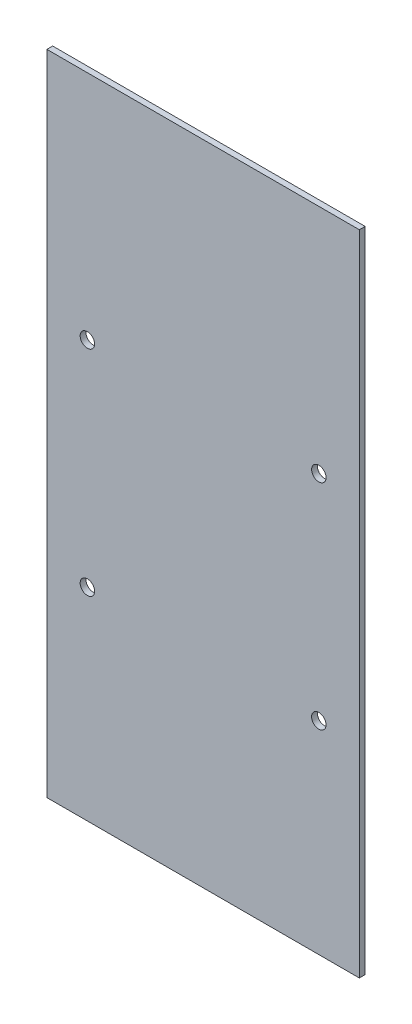
ISO-10303-21;
HEADER;
FILE_DESCRIPTION(('STEP AP214'),'2;1');
FILE_NAME('part.step','',(''),(''),'','','');
FILE_SCHEMA(('AUTOMOTIVE_DESIGN { 1 0 10303 214 1 1 1 1 }'));
ENDSEC;
DATA;
#1=APPLICATION_CONTEXT('core data for automotive mechanical design processes');
#2=APPLICATION_PROTOCOL_DEFINITION('international standard','automotive_design',2000,#1);
#3=PRODUCT_CONTEXT('',#1,'mechanical');
#4=PRODUCT('Part','Part','',(#3));
#5=PRODUCT_RELATED_PRODUCT_CATEGORY('part','',(#4));
#6=PRODUCT_DEFINITION_FORMATION('','',#4);
#7=PRODUCT_DEFINITION_CONTEXT('part definition',#1,'design');
#8=PRODUCT_DEFINITION('design','',#6,#7);
#9=PRODUCT_DEFINITION_SHAPE('','',#8);
#10=(LENGTH_UNIT() NAMED_UNIT(*) SI_UNIT(.MILLI.,.METRE.));
#11=(NAMED_UNIT(*) PLANE_ANGLE_UNIT() SI_UNIT($,.RADIAN.));
#12=(NAMED_UNIT(*) SI_UNIT($,.STERADIAN.) SOLID_ANGLE_UNIT());
#13=UNCERTAINTY_MEASURE_WITH_UNIT(LENGTH_MEASURE(1.E-05),#10,'distance_accuracy_value','');
#14=(GEOMETRIC_REPRESENTATION_CONTEXT(3) GLOBAL_UNCERTAINTY_ASSIGNED_CONTEXT((#13)) GLOBAL_UNIT_ASSIGNED_CONTEXT((#10,
#11,#12)) REPRESENTATION_CONTEXT('',''));
#15=CARTESIAN_POINT('',(0.,0.,0.));
#16=DIRECTION('',(0.,0.,1.));
#17=DIRECTION('',(1.,0.,0.));
#18=AXIS2_PLACEMENT_3D('',#15,#16,#17);
#19=CARTESIAN_POINT('',(0.,0.,1.));
#20=DIRECTION('',(0.,0.,1.));
#21=DIRECTION('',(1.,0.,0.));
#22=AXIS2_PLACEMENT_3D('',#19,#20,#21);
#23=PLANE('',#22);
#24=CARTESIAN_POINT('',(20.,-21.,1.));
#25=DIRECTION('',(0.,0.,1.));
#26=DIRECTION('',(-1.,0.,0.));
#27=AXIS2_PLACEMENT_3D('',#24,#25,#26);
#28=CIRCLE('',#27,1.25);
#29=CARTESIAN_POINT('',(18.75,-21.,1.));
#30=VERTEX_POINT('',#29);
#31=EDGE_CURVE('E148',#30,#30,#28,.T.);
#32=ORIENTED_EDGE('',*,*,#31,.F.);
#33=EDGE_LOOP('',(#32));
#34=FACE_BOUND('',#33,.T.);
#35=CARTESIAN_POINT('',(-20.,16.,1.));
#36=DIRECTION('',(0.,0.,1.));
#37=DIRECTION('',(1.,0.,0.));
#38=AXIS2_PLACEMENT_3D('',#35,#36,#37);
#39=CIRCLE('',#38,1.25);
#40=CARTESIAN_POINT('',(-18.75,16.,1.));
#41=VERTEX_POINT('',#40);
#42=EDGE_CURVE('E118',#41,#41,#39,.T.);
#43=ORIENTED_EDGE('',*,*,#42,.F.);
#44=EDGE_LOOP('',(#43));
#45=FACE_BOUND('',#44,.T.);
#46=DIRECTION('',(0.,1.,0.));
#47=VECTOR('',#46,1.);
#48=CARTESIAN_POINT('',(27.,56.,1.));
#49=LINE('',#48,#47);
#50=CARTESIAN_POINT('',(27.,-56.,1.));
#51=VERTEX_POINT('',#50);
#52=CARTESIAN_POINT('',(27.,56.,1.));
#53=VERTEX_POINT('',#52);
#54=EDGE_CURVE('E98',#51,#53,#49,.T.);
#55=ORIENTED_EDGE('',*,*,#54,.T.);
#56=DIRECTION('',(-1.,0.,0.));
#57=VECTOR('',#56,1.);
#58=CARTESIAN_POINT('',(-27.,56.,1.));
#59=LINE('',#58,#57);
#60=CARTESIAN_POINT('',(-27.,56.,1.));
#61=VERTEX_POINT('',#60);
#62=EDGE_CURVE('E93',#53,#61,#59,.T.);
#63=ORIENTED_EDGE('',*,*,#62,.T.);
#64=DIRECTION('',(0.,-1.,0.));
#65=VECTOR('',#64,1.);
#66=CARTESIAN_POINT('',(-27.,56.,1.));
#67=LINE('',#66,#65);
#68=CARTESIAN_POINT('',(-27.,-56.,1.));
#69=VERTEX_POINT('',#68);
#70=EDGE_CURVE('E96',#61,#69,#67,.T.);
#71=ORIENTED_EDGE('',*,*,#70,.T.);
#72=DIRECTION('',(1.,0.,0.));
#73=VECTOR('',#72,1.);
#74=CARTESIAN_POINT('',(-27.,-56.,1.));
#75=LINE('',#74,#73);
#76=EDGE_CURVE('E63',#69,#51,#75,.T.);
#77=ORIENTED_EDGE('',*,*,#76,.T.);
#78=EDGE_LOOP('',(#55,#63,#71,#77));
#79=FACE_BOUND('',#78,.T.);
#80=CARTESIAN_POINT('',(-20.,-21.,1.));
#81=DIRECTION('',(0.,0.,1.));
#82=DIRECTION('',(1.,0.,0.));
#83=AXIS2_PLACEMENT_3D('',#80,#81,#82);
#84=CIRCLE('',#83,1.25);
#85=CARTESIAN_POINT('',(-18.75,-21.,1.));
#86=VERTEX_POINT('',#85);
#87=EDGE_CURVE('E140',#86,#86,#84,.T.);
#88=ORIENTED_EDGE('',*,*,#87,.F.);
#89=EDGE_LOOP('',(#88));
#90=FACE_BOUND('',#89,.T.);
#91=CARTESIAN_POINT('',(20.,16.,1.));
#92=DIRECTION('',(0.,0.,1.));
#93=DIRECTION('',(-1.,0.,0.));
#94=AXIS2_PLACEMENT_3D('',#91,#92,#93);
#95=CIRCLE('',#94,1.25);
#96=CARTESIAN_POINT('',(18.75,16.,1.));
#97=VERTEX_POINT('',#96);
#98=EDGE_CURVE('E156',#97,#97,#95,.T.);
#99=ORIENTED_EDGE('',*,*,#98,.F.);
#100=EDGE_LOOP('',(#99));
#101=FACE_BOUND('',#100,.T.);
#102=ADVANCED_FACE('F45',(#34,#45,#79,#90,#101),#23,.T.);
#103=CARTESIAN_POINT('',(0.,0.,0.));
#104=DIRECTION('',(0.,0.,1.));
#105=DIRECTION('',(1.,0.,0.));
#106=AXIS2_PLACEMENT_3D('',#103,#104,#105);
#107=PLANE('',#106);
#108=DIRECTION('',(0.,1.,0.));
#109=VECTOR('',#108,1.);
#110=CARTESIAN_POINT('',(27.,56.,0.));
#111=LINE('',#110,#109);
#112=CARTESIAN_POINT('',(27.,-56.,0.));
#113=VERTEX_POINT('',#112);
#114=CARTESIAN_POINT('',(27.,56.,0.));
#115=VERTEX_POINT('',#114);
#116=EDGE_CURVE('E114',#113,#115,#111,.T.);
#117=ORIENTED_EDGE('',*,*,#116,.F.);
#118=DIRECTION('',(1.,0.,0.));
#119=VECTOR('',#118,1.);
#120=CARTESIAN_POINT('',(-27.,-56.,0.));
#121=LINE('',#120,#119);
#122=CARTESIAN_POINT('',(-27.,-56.,0.));
#123=VERTEX_POINT('',#122);
#124=EDGE_CURVE('E86',#123,#113,#121,.T.);
#125=ORIENTED_EDGE('',*,*,#124,.F.);
#126=DIRECTION('',(0.,-1.,0.));
#127=VECTOR('',#126,1.);
#128=CARTESIAN_POINT('',(-27.,56.,0.));
#129=LINE('',#128,#127);
#130=CARTESIAN_POINT('',(-27.,56.,0.));
#131=VERTEX_POINT('',#130);
#132=EDGE_CURVE('E80',#131,#123,#129,.T.);
#133=ORIENTED_EDGE('',*,*,#132,.F.);
#134=DIRECTION('',(-1.,0.,0.));
#135=VECTOR('',#134,1.);
#136=CARTESIAN_POINT('',(-27.,56.,0.));
#137=LINE('',#136,#135);
#138=EDGE_CURVE('E103',#115,#131,#137,.T.);
#139=ORIENTED_EDGE('',*,*,#138,.F.);
#140=EDGE_LOOP('',(#117,#125,#133,#139));
#141=FACE_BOUND('',#140,.T.);
#142=CARTESIAN_POINT('',(-20.,16.,0.));
#143=DIRECTION('',(0.,0.,1.));
#144=DIRECTION('',(1.,0.,0.));
#145=AXIS2_PLACEMENT_3D('',#142,#143,#144);
#146=CIRCLE('',#145,1.25);
#147=CARTESIAN_POINT('',(-18.75,16.,0.));
#148=VERTEX_POINT('',#147);
#149=EDGE_CURVE('E136',#148,#148,#146,.T.);
#150=ORIENTED_EDGE('',*,*,#149,.T.);
#151=EDGE_LOOP('',(#150));
#152=FACE_BOUND('',#151,.T.);
#153=CARTESIAN_POINT('',(-20.,-21.,0.));
#154=DIRECTION('',(0.,0.,1.));
#155=DIRECTION('',(1.,0.,0.));
#156=AXIS2_PLACEMENT_3D('',#153,#154,#155);
#157=CIRCLE('',#156,1.25);
#158=CARTESIAN_POINT('',(-18.75,-21.,0.));
#159=VERTEX_POINT('',#158);
#160=EDGE_CURVE('E144',#159,#159,#157,.T.);
#161=ORIENTED_EDGE('',*,*,#160,.T.);
#162=EDGE_LOOP('',(#161));
#163=FACE_BOUND('',#162,.T.);
#164=CARTESIAN_POINT('',(20.,-21.,0.));
#165=DIRECTION('',(0.,0.,1.));
#166=DIRECTION('',(-1.,0.,0.));
#167=AXIS2_PLACEMENT_3D('',#164,#165,#166);
#168=CIRCLE('',#167,1.25);
#169=CARTESIAN_POINT('',(18.75,-21.,0.));
#170=VERTEX_POINT('',#169);
#171=EDGE_CURVE('E152',#170,#170,#168,.T.);
#172=ORIENTED_EDGE('',*,*,#171,.T.);
#173=EDGE_LOOP('',(#172));
#174=FACE_BOUND('',#173,.T.);
#175=CARTESIAN_POINT('',(20.,16.,0.));
#176=DIRECTION('',(0.,0.,1.));
#177=DIRECTION('',(-1.,0.,0.));
#178=AXIS2_PLACEMENT_3D('',#175,#176,#177);
#179=CIRCLE('',#178,1.25);
#180=CARTESIAN_POINT('',(18.75,16.,0.));
#181=VERTEX_POINT('',#180);
#182=EDGE_CURVE('E160',#181,#181,#179,.T.);
#183=ORIENTED_EDGE('',*,*,#182,.T.);
#184=EDGE_LOOP('',(#183));
#185=FACE_BOUND('',#184,.T.);
#186=ADVANCED_FACE('F131',(#141,#152,#163,#174,#185),#107,.F.);
#187=CARTESIAN_POINT('',(27.,56.,1.));
#188=DIRECTION('',(-1.,0.,0.));
#189=DIRECTION('',(0.,-1.,0.));
#190=AXIS2_PLACEMENT_3D('',#187,#188,#189);
#191=PLANE('',#190);
#192=ORIENTED_EDGE('',*,*,#116,.T.);
#193=DIRECTION('',(0.,0.,-1.));
#194=VECTOR('',#193,1.);
#195=CARTESIAN_POINT('',(27.,56.,1.));
#196=LINE('',#195,#194);
#197=EDGE_CURVE('E11',#53,#115,#196,.T.);
#198=ORIENTED_EDGE('',*,*,#197,.F.);
#199=ORIENTED_EDGE('',*,*,#54,.F.);
#200=DIRECTION('',(0.,0.,-1.));
#201=VECTOR('',#200,1.);
#202=CARTESIAN_POINT('',(27.,-56.,1.));
#203=LINE('',#202,#201);
#204=EDGE_CURVE('E110',#51,#113,#203,.T.);
#205=ORIENTED_EDGE('',*,*,#204,.T.);
#206=EDGE_LOOP('',(#192,#198,#199,#205));
#207=FACE_BOUND('',#206,.T.);
#208=ADVANCED_FACE('F47',(#207),#191,.F.);
#209=CARTESIAN_POINT('',(-27.,56.,1.));
#210=DIRECTION('',(0.,-1.,0.));
#211=DIRECTION('',(1.,0.,0.));
#212=AXIS2_PLACEMENT_3D('',#209,#210,#211);
#213=PLANE('',#212);
#214=ORIENTED_EDGE('',*,*,#138,.T.);
#215=DIRECTION('',(0.,0.,-1.));
#216=VECTOR('',#215,1.);
#217=CARTESIAN_POINT('',(-27.,56.,1.));
#218=LINE('',#217,#216);
#219=EDGE_CURVE('E55',#61,#131,#218,.T.);
#220=ORIENTED_EDGE('',*,*,#219,.F.);
#221=ORIENTED_EDGE('',*,*,#62,.F.);
#222=ORIENTED_EDGE('',*,*,#197,.T.);
#223=EDGE_LOOP('',(#214,#220,#221,#222));
#224=FACE_BOUND('',#223,.T.);
#225=ADVANCED_FACE('F102',(#224),#213,.F.);
#226=CARTESIAN_POINT('',(-27.,56.,1.));
#227=DIRECTION('',(1.,0.,0.));
#228=DIRECTION('',(0.,1.,0.));
#229=AXIS2_PLACEMENT_3D('',#226,#227,#228);
#230=PLANE('',#229);
#231=ORIENTED_EDGE('',*,*,#132,.T.);
#232=DIRECTION('',(0.,0.,-1.));
#233=VECTOR('',#232,1.);
#234=CARTESIAN_POINT('',(-27.,-56.,1.));
#235=LINE('',#234,#233);
#236=EDGE_CURVE('E105',#69,#123,#235,.T.);
#237=ORIENTED_EDGE('',*,*,#236,.F.);
#238=ORIENTED_EDGE('',*,*,#70,.F.);
#239=ORIENTED_EDGE('',*,*,#219,.T.);
#240=EDGE_LOOP('',(#231,#237,#238,#239));
#241=FACE_BOUND('',#240,.T.);
#242=ADVANCED_FACE('F106',(#241),#230,.F.);
#243=CARTESIAN_POINT('',(-27.,-56.,1.));
#244=DIRECTION('',(0.,1.,0.));
#245=DIRECTION('',(0.,0.,1.));
#246=AXIS2_PLACEMENT_3D('',#243,#244,#245);
#247=PLANE('',#246);
#248=ORIENTED_EDGE('',*,*,#124,.T.);
#249=ORIENTED_EDGE('',*,*,#204,.F.);
#250=ORIENTED_EDGE('',*,*,#76,.F.);
#251=ORIENTED_EDGE('',*,*,#236,.T.);
#252=EDGE_LOOP('',(#248,#249,#250,#251));
#253=FACE_BOUND('',#252,.T.);
#254=ADVANCED_FACE('F128',(#253),#247,.F.);
#255=CARTESIAN_POINT('',(-20.,16.,1.));
#256=DIRECTION('',(0.,0.,-1.));
#257=DIRECTION('',(-1.,0.,0.));
#258=AXIS2_PLACEMENT_3D('',#255,#256,#257);
#259=CYLINDRICAL_SURFACE('',#258,1.25);
#260=ORIENTED_EDGE('',*,*,#42,.T.);
#261=EDGE_LOOP('',(#260));
#262=FACE_BOUND('',#261,.T.);
#263=ORIENTED_EDGE('',*,*,#149,.F.);
#264=EDGE_LOOP('',(#263));
#265=FACE_BOUND('',#264,.T.);
#266=ADVANCED_FACE('F181',(#262,#265),#259,.F.);
#267=CARTESIAN_POINT('',(-20.,-21.,1.));
#268=DIRECTION('',(0.,0.,-1.));
#269=DIRECTION('',(-1.,0.,0.));
#270=AXIS2_PLACEMENT_3D('',#267,#268,#269);
#271=CYLINDRICAL_SURFACE('',#270,1.25);
#272=ORIENTED_EDGE('',*,*,#87,.T.);
#273=EDGE_LOOP('',(#272));
#274=FACE_BOUND('',#273,.T.);
#275=ORIENTED_EDGE('',*,*,#160,.F.);
#276=EDGE_LOOP('',(#275));
#277=FACE_BOUND('',#276,.T.);
#278=ADVANCED_FACE('F226',(#274,#277),#271,.F.);
#279=CARTESIAN_POINT('',(20.,-21.,1.));
#280=DIRECTION('',(0.,0.,-1.));
#281=DIRECTION('',(-1.,0.,0.));
#282=AXIS2_PLACEMENT_3D('',#279,#280,#281);
#283=CYLINDRICAL_SURFACE('',#282,1.25);
#284=ORIENTED_EDGE('',*,*,#31,.T.);
#285=EDGE_LOOP('',(#284));
#286=FACE_BOUND('',#285,.T.);
#287=ORIENTED_EDGE('',*,*,#171,.F.);
#288=EDGE_LOOP('',(#287));
#289=FACE_BOUND('',#288,.T.);
#290=ADVANCED_FACE('F234',(#286,#289),#283,.F.);
#291=CARTESIAN_POINT('',(20.,16.,1.));
#292=DIRECTION('',(0.,0.,-1.));
#293=DIRECTION('',(-1.,0.,0.));
#294=AXIS2_PLACEMENT_3D('',#291,#292,#293);
#295=CYLINDRICAL_SURFACE('',#294,1.25);
#296=ORIENTED_EDGE('',*,*,#98,.T.);
#297=EDGE_LOOP('',(#296));
#298=FACE_BOUND('',#297,.T.);
#299=ORIENTED_EDGE('',*,*,#182,.F.);
#300=EDGE_LOOP('',(#299));
#301=FACE_BOUND('',#300,.T.);
#302=ADVANCED_FACE('F168',(#298,#301),#295,.F.);
#303=CLOSED_SHELL('',(#102,#186,#208,#225,#242,#254,#266,#278,#290,#302));
#304=MANIFOLD_SOLID_BREP('B2',#303);
#305=ADVANCED_BREP_SHAPE_REPRESENTATION('',(#18,#304),#14);
#306=SHAPE_DEFINITION_REPRESENTATION(#9,#305);
ENDSEC;
END-ISO-10303-21;
